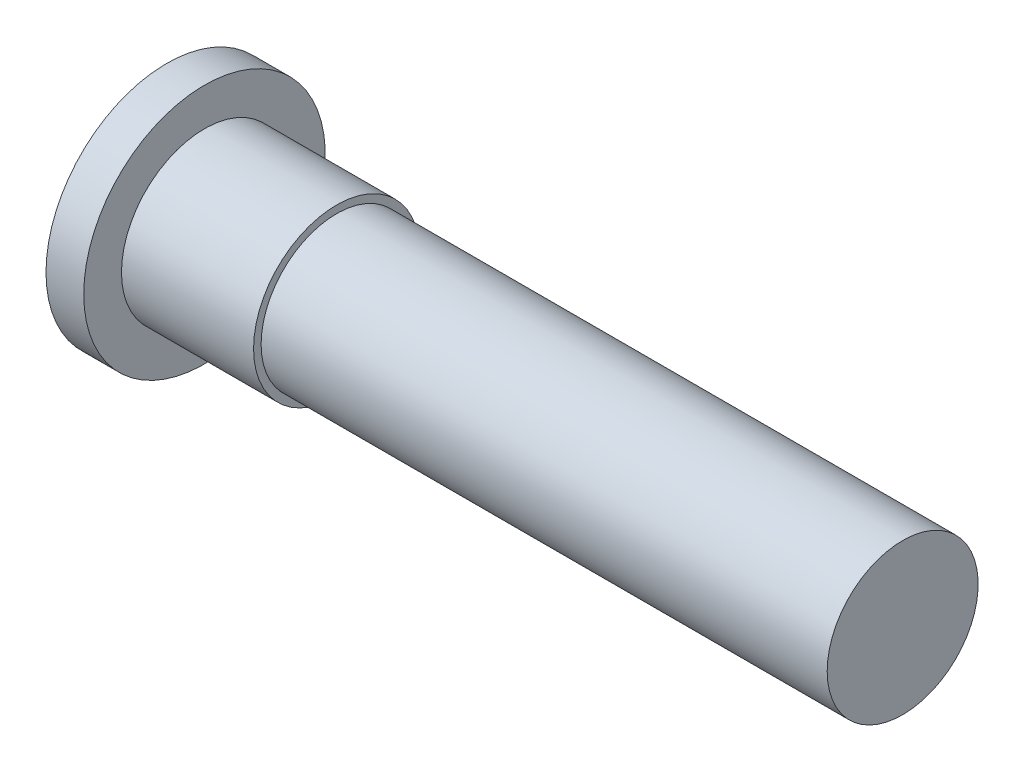
ISO-10303-21;
HEADER;
FILE_DESCRIPTION(('STEP AP214'),'2;1');
FILE_NAME('part.step','',(''),(''),'','','');
FILE_SCHEMA(('AUTOMOTIVE_DESIGN { 1 0 10303 214 1 1 1 1 }'));
ENDSEC;
DATA;
#1=APPLICATION_CONTEXT('core data for automotive mechanical design processes');
#2=APPLICATION_PROTOCOL_DEFINITION('international standard','automotive_design',2000,#1);
#3=PRODUCT_CONTEXT('',#1,'mechanical');
#4=PRODUCT('Part','Part','',(#3));
#5=PRODUCT_RELATED_PRODUCT_CATEGORY('part','',(#4));
#6=PRODUCT_DEFINITION_FORMATION('','',#4);
#7=PRODUCT_DEFINITION_CONTEXT('part definition',#1,'design');
#8=PRODUCT_DEFINITION('design','',#6,#7);
#9=PRODUCT_DEFINITION_SHAPE('','',#8);
#10=(LENGTH_UNIT() NAMED_UNIT(*) SI_UNIT(.MILLI.,.METRE.));
#11=(NAMED_UNIT(*) PLANE_ANGLE_UNIT() SI_UNIT($,.RADIAN.));
#12=(NAMED_UNIT(*) SI_UNIT($,.STERADIAN.) SOLID_ANGLE_UNIT());
#13=UNCERTAINTY_MEASURE_WITH_UNIT(LENGTH_MEASURE(1.E-05),#10,'distance_accuracy_value','');
#14=(GEOMETRIC_REPRESENTATION_CONTEXT(3) GLOBAL_UNCERTAINTY_ASSIGNED_CONTEXT((#13)) GLOBAL_UNIT_ASSIGNED_CONTEXT((#10,
#11,#12)) REPRESENTATION_CONTEXT('',''));
#15=CARTESIAN_POINT('',(0.,0.,0.));
#16=DIRECTION('',(0.,0.,1.));
#17=DIRECTION('',(1.,0.,0.));
#18=AXIS2_PLACEMENT_3D('',#15,#16,#17);
#19=CARTESIAN_POINT('',(0.,0.,0.));
#20=DIRECTION('',(1.,0.,0.));
#21=DIRECTION('',(0.,0.,-1.));
#22=AXIS2_PLACEMENT_3D('',#19,#20,#21);
#23=PLANE('',#22);
#24=CARTESIAN_POINT('',(0.,0.,0.));
#25=DIRECTION('',(-1.,0.,0.));
#26=DIRECTION('',(0.,0.,1.));
#27=AXIS2_PLACEMENT_3D('',#24,#25,#26);
#28=CIRCLE('',#27,16.);
#29=CARTESIAN_POINT('',(0.,0.,16.));
#30=VERTEX_POINT('',#29);
#31=EDGE_CURVE('E10',#30,#30,#28,.T.);
#32=ORIENTED_EDGE('',*,*,#31,.T.);
#33=EDGE_LOOP('',(#32));
#34=FACE_BOUND('',#33,.T.);
#35=ADVANCED_FACE('F33',(#34),#23,.F.);
#36=CARTESIAN_POINT('',(-110.729499132174,0.,0.));
#37=DIRECTION('',(-1.,0.,0.));
#38=DIRECTION('',(0.,0.,1.));
#39=AXIS2_PLACEMENT_3D('',#36,#37,#38);
#40=CYLINDRICAL_SURFACE('',#39,16.);
#41=ORIENTED_EDGE('',*,*,#31,.F.);
#42=EDGE_LOOP('',(#41));
#43=FACE_BOUND('',#42,.T.);
#44=CARTESIAN_POINT('',(5.,0.,0.));
#45=DIRECTION('',(-1.,0.,0.));
#46=DIRECTION('',(0.,0.,1.));
#47=AXIS2_PLACEMENT_3D('',#44,#45,#46);
#48=CIRCLE('',#47,16.);
#49=CARTESIAN_POINT('',(5.,0.,16.));
#50=VERTEX_POINT('',#49);
#51=EDGE_CURVE('E39',#50,#50,#48,.T.);
#52=ORIENTED_EDGE('',*,*,#51,.T.);
#53=EDGE_LOOP('',(#52));
#54=FACE_BOUND('',#53,.T.);
#55=ADVANCED_FACE('F71',(#43,#54),#40,.T.);
#56=CARTESIAN_POINT('',(5.00000000000001,0.,-16.));
#57=DIRECTION('',(-1.,0.,0.));
#58=DIRECTION('',(0.,0.,1.));
#59=AXIS2_PLACEMENT_3D('',#56,#57,#58);
#60=PLANE('',#59);
#61=ORIENTED_EDGE('',*,*,#51,.F.);
#62=EDGE_LOOP('',(#61));
#63=FACE_BOUND('',#62,.T.);
#64=CARTESIAN_POINT('',(5.,0.,0.));
#65=DIRECTION('',(-1.,0.,0.));
#66=DIRECTION('',(0.,0.,1.));
#67=AXIS2_PLACEMENT_3D('',#64,#65,#66);
#68=CIRCLE('',#67,11.);
#69=CARTESIAN_POINT('',(5.,0.,11.));
#70=VERTEX_POINT('',#69);
#71=EDGE_CURVE('E43',#70,#70,#68,.T.);
#72=ORIENTED_EDGE('',*,*,#71,.T.);
#73=EDGE_LOOP('',(#72));
#74=FACE_BOUND('',#73,.T.);
#75=ADVANCED_FACE('F75',(#63,#74),#60,.F.);
#76=CARTESIAN_POINT('',(-110.729499132174,0.,0.));
#77=DIRECTION('',(-1.,0.,0.));
#78=DIRECTION('',(0.,0.,1.));
#79=AXIS2_PLACEMENT_3D('',#76,#77,#78);
#80=CYLINDRICAL_SURFACE('',#79,11.);
#81=ORIENTED_EDGE('',*,*,#71,.F.);
#82=EDGE_LOOP('',(#81));
#83=FACE_BOUND('',#82,.T.);
#84=CARTESIAN_POINT('',(22.5,0.,0.));
#85=DIRECTION('',(-1.,0.,0.));
#86=DIRECTION('',(0.,0.,1.));
#87=AXIS2_PLACEMENT_3D('',#84,#85,#86);
#88=CIRCLE('',#87,11.);
#89=CARTESIAN_POINT('',(22.5,0.,11.));
#90=VERTEX_POINT('',#89);
#91=EDGE_CURVE('E47',#90,#90,#88,.T.);
#92=ORIENTED_EDGE('',*,*,#91,.T.);
#93=EDGE_LOOP('',(#92));
#94=FACE_BOUND('',#93,.T.);
#95=ADVANCED_FACE('F80',(#83,#94),#80,.T.);
#96=CARTESIAN_POINT('',(22.5,0.,-11.));
#97=DIRECTION('',(-1.,0.,0.));
#98=DIRECTION('',(0.,0.,1.));
#99=AXIS2_PLACEMENT_3D('',#96,#97,#98);
#100=PLANE('',#99);
#101=ORIENTED_EDGE('',*,*,#91,.F.);
#102=EDGE_LOOP('',(#101));
#103=FACE_BOUND('',#102,.T.);
#104=CARTESIAN_POINT('',(22.5,0.,0.));
#105=DIRECTION('',(-1.,0.,0.));
#106=DIRECTION('',(0.,0.,1.));
#107=AXIS2_PLACEMENT_3D('',#104,#105,#106);
#108=CIRCLE('',#107,10.);
#109=CARTESIAN_POINT('',(22.5,0.,10.));
#110=VERTEX_POINT('',#109);
#111=EDGE_CURVE('E52',#110,#110,#108,.T.);
#112=ORIENTED_EDGE('',*,*,#111,.T.);
#113=EDGE_LOOP('',(#112));
#114=FACE_BOUND('',#113,.T.);
#115=ADVANCED_FACE('F67',(#103,#114),#100,.F.);
#116=CARTESIAN_POINT('',(-110.729499132174,0.,0.));
#117=DIRECTION('',(-1.,0.,0.));
#118=DIRECTION('',(0.,0.,1.));
#119=AXIS2_PLACEMENT_3D('',#116,#117,#118);
#120=CYLINDRICAL_SURFACE('',#119,10.);
#121=ORIENTED_EDGE('',*,*,#111,.F.);
#122=EDGE_LOOP('',(#121));
#123=FACE_BOUND('',#122,.T.);
#124=CARTESIAN_POINT('',(97.5,0.,0.));
#125=DIRECTION('',(-1.,0.,0.));
#126=DIRECTION('',(0.,0.,1.));
#127=AXIS2_PLACEMENT_3D('',#124,#125,#126);
#128=CIRCLE('',#127,10.);
#129=CARTESIAN_POINT('',(97.5,0.,10.));
#130=VERTEX_POINT('',#129);
#131=EDGE_CURVE('E55',#130,#130,#128,.T.);
#132=ORIENTED_EDGE('',*,*,#131,.T.);
#133=EDGE_LOOP('',(#132));
#134=FACE_BOUND('',#133,.T.);
#135=ADVANCED_FACE('F59',(#123,#134),#120,.T.);
#136=CARTESIAN_POINT('',(97.5,0.,-10.));
#137=DIRECTION('',(-1.,0.,0.));
#138=DIRECTION('',(0.,0.,1.));
#139=AXIS2_PLACEMENT_3D('',#136,#137,#138);
#140=PLANE('',#139);
#141=ORIENTED_EDGE('',*,*,#131,.F.);
#142=EDGE_LOOP('',(#141));
#143=FACE_BOUND('',#142,.T.);
#144=ADVANCED_FACE('F61',(#143),#140,.F.);
#145=CLOSED_SHELL('',(#35,#55,#75,#95,#115,#135,#144));
#146=MANIFOLD_SOLID_BREP('B2',#145);
#147=ADVANCED_BREP_SHAPE_REPRESENTATION('',(#18,#146),#14);
#148=SHAPE_DEFINITION_REPRESENTATION(#9,#147);
ENDSEC;
END-ISO-10303-21;
